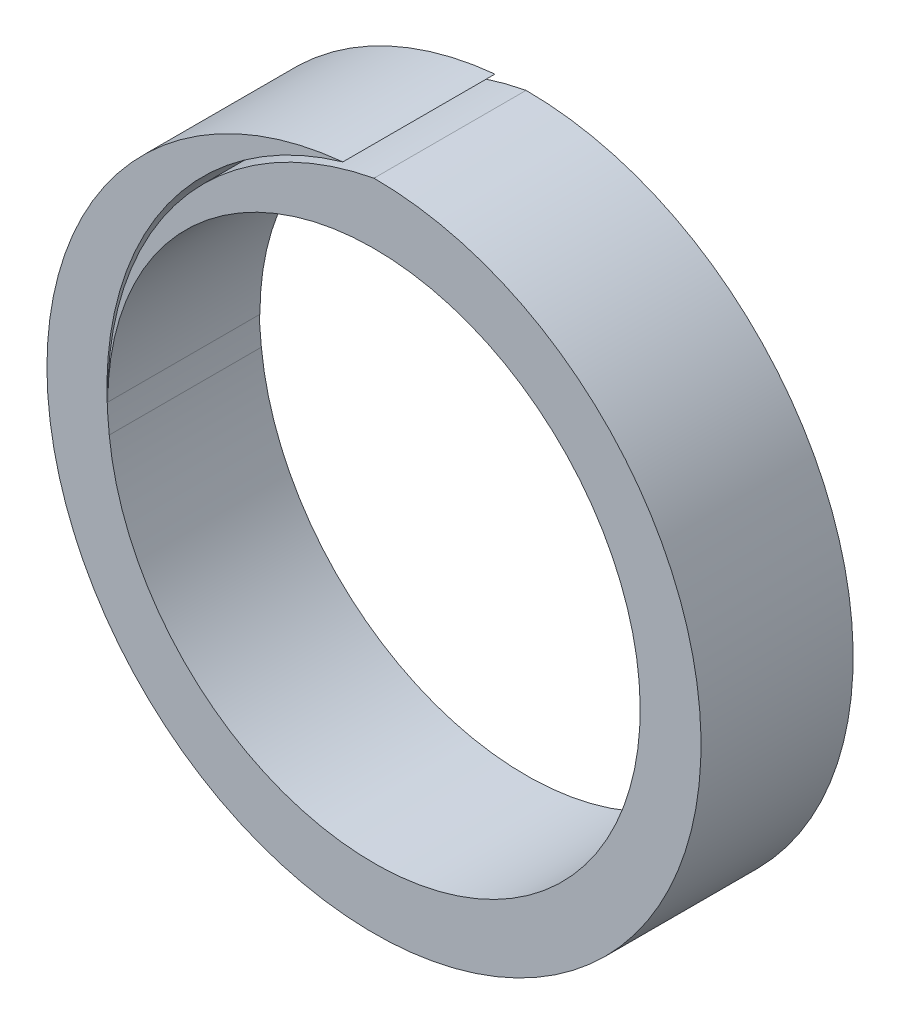
ISO-10303-21;
HEADER;
FILE_DESCRIPTION(('STEP AP214'),'2;1');
FILE_NAME('part.step','',(''),(''),'','','');
FILE_SCHEMA(('AUTOMOTIVE_DESIGN { 1 0 10303 214 1 1 1 1 }'));
ENDSEC;
DATA;
#1=APPLICATION_CONTEXT('core data for automotive mechanical design processes');
#2=APPLICATION_PROTOCOL_DEFINITION('international standard','automotive_design',2000,#1);
#3=PRODUCT_CONTEXT('',#1,'mechanical');
#4=PRODUCT('Part','Part','',(#3));
#5=PRODUCT_RELATED_PRODUCT_CATEGORY('part','',(#4));
#6=PRODUCT_DEFINITION_FORMATION('','',#4);
#7=PRODUCT_DEFINITION_CONTEXT('part definition',#1,'design');
#8=PRODUCT_DEFINITION('design','',#6,#7);
#9=PRODUCT_DEFINITION_SHAPE('','',#8);
#10=(LENGTH_UNIT() NAMED_UNIT(*) SI_UNIT(.MILLI.,.METRE.));
#11=(NAMED_UNIT(*) PLANE_ANGLE_UNIT() SI_UNIT($,.RADIAN.));
#12=(NAMED_UNIT(*) SI_UNIT($,.STERADIAN.) SOLID_ANGLE_UNIT());
#13=UNCERTAINTY_MEASURE_WITH_UNIT(LENGTH_MEASURE(1.E-05),#10,'distance_accuracy_value','');
#14=(GEOMETRIC_REPRESENTATION_CONTEXT(3) GLOBAL_UNCERTAINTY_ASSIGNED_CONTEXT((#13)) GLOBAL_UNIT_ASSIGNED_CONTEXT((#10,
#11,#12)) REPRESENTATION_CONTEXT('',''));
#15=CARTESIAN_POINT('',(0.,0.,0.));
#16=DIRECTION('',(0.,0.,1.));
#17=DIRECTION('',(1.,0.,0.));
#18=AXIS2_PLACEMENT_3D('',#15,#16,#17);
#19=CARTESIAN_POINT('',(1.99836686698719,0.187375805940657,5.));
#20=DIRECTION('',(0.,0.,-1.));
#21=DIRECTION('',(-1.,0.,0.));
#22=AXIS2_PLACEMENT_3D('',#19,#20,#21);
#23=CYLINDRICAL_SURFACE('',#22,10.75);
#24=CARTESIAN_POINT('',(1.99836686698719,0.187375805940657,0.));
#25=DIRECTION('',(0.,0.,1.));
#26=DIRECTION('',(1.,0.,0.));
#27=AXIS2_PLACEMENT_3D('',#24,#25,#26);
#28=CIRCLE('',#27,10.75);
#29=CARTESIAN_POINT('',(0.,10.75,0.));
#30=VERTEX_POINT('',#29);
#31=CARTESIAN_POINT('',(-8.75,0.,0.));
#32=VERTEX_POINT('',#31);
#33=EDGE_CURVE('E111',#30,#32,#28,.T.);
#34=ORIENTED_EDGE('',*,*,#33,.T.);
#35=DIRECTION('',(0.,0.,-1.));
#36=VECTOR('',#35,1.);
#37=CARTESIAN_POINT('',(-8.75,0.,5.));
#38=LINE('',#37,#36);
#39=CARTESIAN_POINT('',(-8.75,0.,5.));
#40=VERTEX_POINT('',#39);
#41=EDGE_CURVE('E12',#40,#32,#38,.T.);
#42=ORIENTED_EDGE('',*,*,#41,.F.);
#43=CARTESIAN_POINT('',(1.99836686698719,0.187375805940657,5.));
#44=DIRECTION('',(0.,0.,1.));
#45=DIRECTION('',(1.,0.,0.));
#46=AXIS2_PLACEMENT_3D('',#43,#44,#45);
#47=CIRCLE('',#46,10.75);
#48=CARTESIAN_POINT('',(0.,10.75,5.));
#49=VERTEX_POINT('',#48);
#50=EDGE_CURVE('E84',#49,#40,#47,.T.);
#51=ORIENTED_EDGE('',*,*,#50,.F.);
#52=DIRECTION('',(0.,0.,-1.));
#53=VECTOR('',#52,1.);
#54=CARTESIAN_POINT('',(0.,10.75,5.));
#55=LINE('',#54,#53);
#56=EDGE_CURVE('E92',#49,#30,#55,.T.);
#57=ORIENTED_EDGE('',*,*,#56,.T.);
#58=EDGE_LOOP('',(#34,#42,#51,#57));
#59=FACE_BOUND('',#58,.T.);
#60=ADVANCED_FACE('F33',(#59),#23,.T.);
#61=CARTESIAN_POINT('',(0.,0.,5.));
#62=DIRECTION('',(0.,0.,-1.));
#63=DIRECTION('',(-1.,0.,0.));
#64=AXIS2_PLACEMENT_3D('',#61,#62,#63);
#65=CYLINDRICAL_SURFACE('',#64,8.75);
#66=CARTESIAN_POINT('',(0.,0.,0.));
#67=DIRECTION('',(0.,0.,-1.));
#68=DIRECTION('',(1.,0.,0.));
#69=AXIS2_PLACEMENT_3D('',#66,#67,#68);
#70=CIRCLE('',#69,8.75);
#71=CARTESIAN_POINT('',(-8.70228315352452,-0.912561184734088,0.));
#72=VERTEX_POINT('',#71);
#73=EDGE_CURVE('E88',#32,#72,#70,.T.);
#74=ORIENTED_EDGE('',*,*,#73,.T.);
#75=DIRECTION('',(0.,0.,-1.));
#76=VECTOR('',#75,1.);
#77=CARTESIAN_POINT('',(-8.70228315352452,-0.912561184734088,5.));
#78=LINE('',#77,#76);
#79=CARTESIAN_POINT('',(-8.70228315352452,-0.912561184734088,5.));
#80=VERTEX_POINT('',#79);
#81=EDGE_CURVE('E41',#80,#72,#78,.T.);
#82=ORIENTED_EDGE('',*,*,#81,.F.);
#83=CARTESIAN_POINT('',(0.,0.,5.));
#84=DIRECTION('',(0.,0.,-1.));
#85=DIRECTION('',(1.,0.,0.));
#86=AXIS2_PLACEMENT_3D('',#83,#84,#85);
#87=CIRCLE('',#86,8.75);
#88=EDGE_CURVE('E79',#40,#80,#87,.T.);
#89=ORIENTED_EDGE('',*,*,#88,.F.);
#90=ORIENTED_EDGE('',*,*,#41,.T.);
#91=EDGE_LOOP('',(#74,#82,#89,#90));
#92=FACE_BOUND('',#91,.T.);
#93=ADVANCED_FACE('F87',(#92),#65,.F.);
#94=CARTESIAN_POINT('',(1.97014779662146,0.376515079249577,5.));
#95=DIRECTION('',(0.,0.,-1.));
#96=DIRECTION('',(-1.,0.,0.));
#97=AXIS2_PLACEMENT_3D('',#94,#95,#96);
#98=CYLINDRICAL_SURFACE('',#97,10.75);
#99=CARTESIAN_POINT('',(1.97014779662146,0.376515079249577,0.));
#100=DIRECTION('',(0.,0.,-1.));
#101=DIRECTION('',(-1.,0.,0.));
#102=AXIS2_PLACEMENT_3D('',#99,#100,#101);
#103=CIRCLE('',#102,10.75);
#104=CARTESIAN_POINT('',(-1.0240388461484,10.701114168234,0.));
#105=VERTEX_POINT('',#104);
#106=EDGE_CURVE('E66',#72,#105,#103,.T.);
#107=ORIENTED_EDGE('',*,*,#106,.T.);
#108=DIRECTION('',(0.,0.,-1.));
#109=VECTOR('',#108,1.);
#110=CARTESIAN_POINT('',(-1.0240388461484,10.701114168234,5.));
#111=LINE('',#110,#109);
#112=CARTESIAN_POINT('',(-1.0240388461484,10.701114168234,5.));
#113=VERTEX_POINT('',#112);
#114=EDGE_CURVE('E89',#113,#105,#111,.T.);
#115=ORIENTED_EDGE('',*,*,#114,.F.);
#116=CARTESIAN_POINT('',(1.97014779662146,0.376515079249577,5.));
#117=DIRECTION('',(0.,0.,-1.));
#118=DIRECTION('',(-1.,0.,0.));
#119=AXIS2_PLACEMENT_3D('',#116,#117,#118);
#120=CIRCLE('',#119,10.75);
#121=EDGE_CURVE('E82',#80,#113,#120,.T.);
#122=ORIENTED_EDGE('',*,*,#121,.F.);
#123=ORIENTED_EDGE('',*,*,#81,.T.);
#124=EDGE_LOOP('',(#107,#115,#122,#123));
#125=FACE_BOUND('',#124,.T.);
#126=ADVANCED_FACE('F90',(#125),#98,.F.);
#127=CARTESIAN_POINT('',(0.,0.,5.));
#128=DIRECTION('',(0.,0.,-1.));
#129=DIRECTION('',(-1.,0.,0.));
#130=AXIS2_PLACEMENT_3D('',#127,#128,#129);
#131=CYLINDRICAL_SURFACE('',#130,10.75);
#132=CARTESIAN_POINT('',(0.,0.,0.));
#133=DIRECTION('',(0.,0.,1.));
#134=DIRECTION('',(1.,0.,0.));
#135=AXIS2_PLACEMENT_3D('',#132,#133,#134);
#136=CIRCLE('',#135,10.75);
#137=EDGE_CURVE('E72',#105,#30,#136,.T.);
#138=ORIENTED_EDGE('',*,*,#137,.T.);
#139=ORIENTED_EDGE('',*,*,#56,.F.);
#140=CARTESIAN_POINT('',(0.,0.,5.));
#141=DIRECTION('',(0.,0.,1.));
#142=DIRECTION('',(1.,0.,0.));
#143=AXIS2_PLACEMENT_3D('',#140,#141,#142);
#144=CIRCLE('',#143,10.75);
#145=EDGE_CURVE('E49',#113,#49,#144,.T.);
#146=ORIENTED_EDGE('',*,*,#145,.F.);
#147=ORIENTED_EDGE('',*,*,#114,.T.);
#148=EDGE_LOOP('',(#138,#139,#146,#147));
#149=FACE_BOUND('',#148,.T.);
#150=ADVANCED_FACE('F106',(#149),#131,.T.);
#151=CARTESIAN_POINT('',(0.999183433493595,0.0936879029703286,5.));
#152=DIRECTION('',(0.,0.,1.));
#153=DIRECTION('',(1.,0.,0.));
#154=AXIS2_PLACEMENT_3D('',#151,#152,#153);
#155=PLANE('',#154);
#156=ORIENTED_EDGE('',*,*,#50,.T.);
#157=ORIENTED_EDGE('',*,*,#88,.T.);
#158=ORIENTED_EDGE('',*,*,#121,.T.);
#159=ORIENTED_EDGE('',*,*,#145,.T.);
#160=EDGE_LOOP('',(#156,#157,#158,#159));
#161=FACE_BOUND('',#160,.T.);
#162=ADVANCED_FACE('F80',(#161),#155,.T.);
#163=CARTESIAN_POINT('',(0.999183433493595,0.0936879029703286,0.));
#164=DIRECTION('',(0.,0.,1.));
#165=DIRECTION('',(1.,0.,0.));
#166=AXIS2_PLACEMENT_3D('',#163,#164,#165);
#167=PLANE('',#166);
#168=ORIENTED_EDGE('',*,*,#33,.F.);
#169=ORIENTED_EDGE('',*,*,#137,.F.);
#170=ORIENTED_EDGE('',*,*,#106,.F.);
#171=ORIENTED_EDGE('',*,*,#73,.F.);
#172=EDGE_LOOP('',(#168,#169,#170,#171));
#173=FACE_BOUND('',#172,.T.);
#174=ADVANCED_FACE('F109',(#173),#167,.F.);
#175=CLOSED_SHELL('',(#60,#93,#126,#150,#162,#174));
#176=MANIFOLD_SOLID_BREP('B2',#175);
#177=ADVANCED_BREP_SHAPE_REPRESENTATION('',(#18,#176),#14);
#178=SHAPE_DEFINITION_REPRESENTATION(#9,#177);
ENDSEC;
END-ISO-10303-21;
